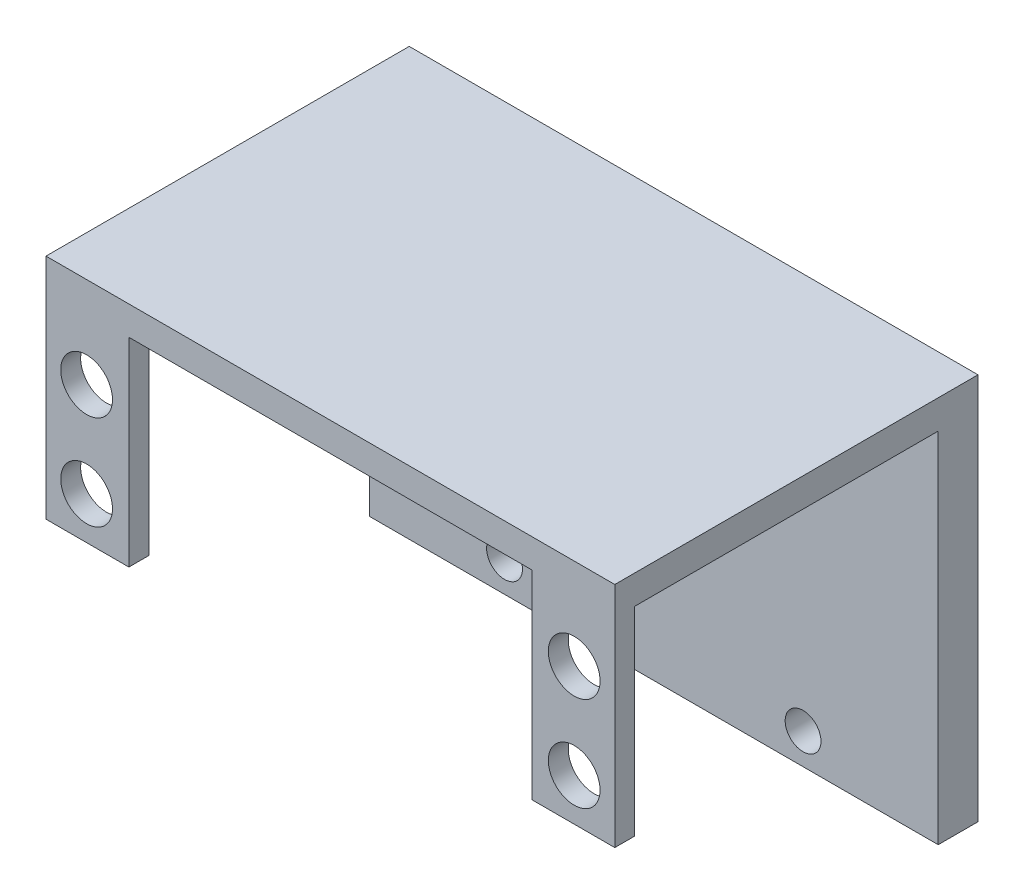
ISO-10303-21;
HEADER;
FILE_DESCRIPTION(('STEP AP214'),'2;1');
FILE_NAME('part.step','',(''),(''),'','','');
FILE_SCHEMA(('AUTOMOTIVE_DESIGN { 1 0 10303 214 1 1 1 1 }'));
ENDSEC;
DATA;
#1=APPLICATION_CONTEXT('core data for automotive mechanical design processes');
#2=APPLICATION_PROTOCOL_DEFINITION('international standard','automotive_design',2000,#1);
#3=PRODUCT_CONTEXT('',#1,'mechanical');
#4=PRODUCT('Part','Part','',(#3));
#5=PRODUCT_RELATED_PRODUCT_CATEGORY('part','',(#4));
#6=PRODUCT_DEFINITION_FORMATION('','',#4);
#7=PRODUCT_DEFINITION_CONTEXT('part definition',#1,'design');
#8=PRODUCT_DEFINITION('design','',#6,#7);
#9=PRODUCT_DEFINITION_SHAPE('','',#8);
#10=(LENGTH_UNIT() NAMED_UNIT(*) SI_UNIT(.MILLI.,.METRE.));
#11=(NAMED_UNIT(*) PLANE_ANGLE_UNIT() SI_UNIT($,.RADIAN.));
#12=(NAMED_UNIT(*) SI_UNIT($,.STERADIAN.) SOLID_ANGLE_UNIT());
#13=UNCERTAINTY_MEASURE_WITH_UNIT(LENGTH_MEASURE(1.E-05),#10,'distance_accuracy_value','');
#14=(GEOMETRIC_REPRESENTATION_CONTEXT(3) GLOBAL_UNCERTAINTY_ASSIGNED_CONTEXT((#13)) GLOBAL_UNIT_ASSIGNED_CONTEXT((#10,
#11,#12)) REPRESENTATION_CONTEXT('',''));
#15=CARTESIAN_POINT('',(0.,0.,0.));
#16=DIRECTION('',(0.,0.,1.));
#17=DIRECTION('',(1.,0.,0.));
#18=AXIS2_PLACEMENT_3D('',#15,#16,#17);
#19=CARTESIAN_POINT('',(28.5798247961856,0.,2.));
#20=DIRECTION('',(-1.,0.,0.));
#21=DIRECTION('',(0.,0.,1.));
#22=AXIS2_PLACEMENT_3D('',#19,#20,#21);
#23=PLANE('',#22);
#24=DIRECTION('',(0.,1.,0.));
#25=VECTOR('',#24,1.);
#26=CARTESIAN_POINT('',(28.5798247961856,0.,0.));
#27=LINE('',#26,#25);
#28=CARTESIAN_POINT('',(28.5798247961856,-8.99999999999997,0.));
#29=VERTEX_POINT('',#28);
#30=CARTESIAN_POINT('',(28.5798247961856,11.,0.));
#31=VERTEX_POINT('',#30);
#32=EDGE_CURVE('E257',#29,#31,#27,.T.);
#33=ORIENTED_EDGE('',*,*,#32,.T.);
#34=DIRECTION('',(0.,0.,1.));
#35=VECTOR('',#34,1.);
#36=CARTESIAN_POINT('',(28.5798247961856,11.,-30.5));
#37=LINE('',#36,#35);
#38=CARTESIAN_POINT('',(28.5798247961856,11.,-30.5));
#39=VERTEX_POINT('',#38);
#40=EDGE_CURVE('E160',#39,#31,#37,.T.);
#41=ORIENTED_EDGE('',*,*,#40,.F.);
#42=DIRECTION('',(0.,1.,0.));
#43=VECTOR('',#42,1.);
#44=CARTESIAN_POINT('',(28.5798247961856,-25.,-30.5));
#45=LINE('',#44,#43);
#46=CARTESIAN_POINT('',(28.5798247961856,-25.,-30.5));
#47=VERTEX_POINT('',#46);
#48=EDGE_CURVE('E150',#47,#39,#45,.T.);
#49=ORIENTED_EDGE('',*,*,#48,.F.);
#50=DIRECTION('',(0.,0.,1.));
#51=VECTOR('',#50,1.);
#52=CARTESIAN_POINT('',(28.5798247961856,-25.,-34.5));
#53=LINE('',#52,#51);
#54=CARTESIAN_POINT('',(28.5798247961856,-25.,-34.5));
#55=VERTEX_POINT('',#54);
#56=EDGE_CURVE('E207',#55,#47,#53,.T.);
#57=ORIENTED_EDGE('',*,*,#56,.F.);
#58=DIRECTION('',(0.,-1.,0.));
#59=VECTOR('',#58,1.);
#60=CARTESIAN_POINT('',(28.5798247961856,21.9,-34.5));
#61=LINE('',#60,#59);
#62=CARTESIAN_POINT('',(28.5798247961856,13.9,-34.5));
#63=VERTEX_POINT('',#62);
#64=EDGE_CURVE('E218',#63,#55,#61,.T.);
#65=ORIENTED_EDGE('',*,*,#64,.F.);
#66=DIRECTION('',(0.,0.,-1.));
#67=VECTOR('',#66,1.);
#68=CARTESIAN_POINT('',(28.5798247961856,13.9,2.));
#69=LINE('',#68,#67);
#70=CARTESIAN_POINT('',(28.5798247961856,13.9,2.));
#71=VERTEX_POINT('',#70);
#72=EDGE_CURVE('E182',#71,#63,#69,.T.);
#73=ORIENTED_EDGE('',*,*,#72,.F.);
#74=DIRECTION('',(0.,1.,0.));
#75=VECTOR('',#74,1.);
#76=CARTESIAN_POINT('',(28.5798247961856,0.,2.));
#77=LINE('',#76,#75);
#78=CARTESIAN_POINT('',(28.5798247961856,-8.99999999999997,2.));
#79=VERTEX_POINT('',#78);
#80=EDGE_CURVE('E92',#79,#71,#77,.T.);
#81=ORIENTED_EDGE('',*,*,#80,.F.);
#82=DIRECTION('',(0.,0.,-1.));
#83=VECTOR('',#82,1.);
#84=CARTESIAN_POINT('',(28.5798247961856,-8.99999999999997,2.));
#85=LINE('',#84,#83);
#86=EDGE_CURVE('E11',#79,#29,#85,.T.);
#87=ORIENTED_EDGE('',*,*,#86,.T.);
#88=EDGE_LOOP('',(#33,#41,#49,#57,#65,#73,#81,#87));
#89=FACE_BOUND('',#88,.T.);
#90=ADVANCED_FACE('F41',(#89),#23,.F.);
#91=CARTESIAN_POINT('',(-28.5798247961856,0.,2.));
#92=DIRECTION('',(-1.,0.,0.));
#93=DIRECTION('',(0.,0.,1.));
#94=AXIS2_PLACEMENT_3D('',#91,#92,#93);
#95=PLANE('',#94);
#96=DIRECTION('',(0.,0.,-1.));
#97=VECTOR('',#96,1.);
#98=CARTESIAN_POINT('',(-28.5798247961856,11.,0.));
#99=LINE('',#98,#97);
#100=CARTESIAN_POINT('',(-28.5798247961856,11.,0.));
#101=VERTEX_POINT('',#100);
#102=CARTESIAN_POINT('',(-28.5798247961856,11.,-30.5));
#103=VERTEX_POINT('',#102);
#104=EDGE_CURVE('E146',#101,#103,#99,.T.);
#105=ORIENTED_EDGE('',*,*,#104,.F.);
#106=DIRECTION('',(0.,1.,0.));
#107=VECTOR('',#106,1.);
#108=CARTESIAN_POINT('',(-28.5798247961856,0.,0.));
#109=LINE('',#108,#107);
#110=CARTESIAN_POINT('',(-28.5798247961856,-8.99999999999997,0.));
#111=VERTEX_POINT('',#110);
#112=EDGE_CURVE('E259',#111,#101,#109,.T.);
#113=ORIENTED_EDGE('',*,*,#112,.F.);
#114=DIRECTION('',(0.,0.,-1.));
#115=VECTOR('',#114,1.);
#116=CARTESIAN_POINT('',(-28.5798247961856,-8.99999999999997,2.));
#117=LINE('',#116,#115);
#118=CARTESIAN_POINT('',(-28.5798247961856,-8.99999999999997,2.));
#119=VERTEX_POINT('',#118);
#120=EDGE_CURVE('E51',#119,#111,#117,.T.);
#121=ORIENTED_EDGE('',*,*,#120,.F.);
#122=DIRECTION('',(0.,1.,0.));
#123=VECTOR('',#122,1.);
#124=CARTESIAN_POINT('',(-28.5798247961856,0.,2.));
#125=LINE('',#124,#123);
#126=CARTESIAN_POINT('',(-28.5798247961856,13.9,2.));
#127=VERTEX_POINT('',#126);
#128=EDGE_CURVE('E234',#119,#127,#125,.T.);
#129=ORIENTED_EDGE('',*,*,#128,.T.);
#130=DIRECTION('',(0.,0.,1.));
#131=VECTOR('',#130,1.);
#132=CARTESIAN_POINT('',(-28.5798247961856,13.9,-34.5));
#133=LINE('',#132,#131);
#134=CARTESIAN_POINT('',(-28.5798247961856,13.9,-34.5));
#135=VERTEX_POINT('',#134);
#136=EDGE_CURVE('E188',#135,#127,#133,.T.);
#137=ORIENTED_EDGE('',*,*,#136,.F.);
#138=DIRECTION('',(0.,1.,0.));
#139=VECTOR('',#138,1.);
#140=CARTESIAN_POINT('',(-28.5798247961856,10.,-34.5));
#141=LINE('',#140,#139);
#142=CARTESIAN_POINT('',(-28.5798247961856,-25.,-34.5));
#143=VERTEX_POINT('',#142);
#144=EDGE_CURVE('E216',#143,#135,#141,.T.);
#145=ORIENTED_EDGE('',*,*,#144,.F.);
#146=DIRECTION('',(0.,0.,-1.));
#147=VECTOR('',#146,1.);
#148=CARTESIAN_POINT('',(-28.5798247961856,-25.,-34.5));
#149=LINE('',#148,#147);
#150=CARTESIAN_POINT('',(-28.5798247961856,-25.,-30.5));
#151=VERTEX_POINT('',#150);
#152=EDGE_CURVE('E148',#151,#143,#149,.T.);
#153=ORIENTED_EDGE('',*,*,#152,.F.);
#154=DIRECTION('',(0.,1.,0.));
#155=VECTOR('',#154,1.);
#156=CARTESIAN_POINT('',(-28.5798247961856,-25.,-30.5));
#157=LINE('',#156,#155);
#158=EDGE_CURVE('E141',#151,#103,#157,.T.);
#159=ORIENTED_EDGE('',*,*,#158,.T.);
#160=EDGE_LOOP('',(#105,#113,#121,#129,#137,#145,#153,#159));
#161=FACE_BOUND('',#160,.T.);
#162=ADVANCED_FACE('F143',(#161),#95,.T.);
#163=CARTESIAN_POINT('',(0.,0.,2.));
#164=DIRECTION('',(0.,0.,1.));
#165=DIRECTION('',(1.,0.,0.));
#166=AXIS2_PLACEMENT_3D('',#163,#164,#165);
#167=PLANE('',#166);
#168=DIRECTION('',(0.,1.,0.));
#169=VECTOR('',#168,1.);
#170=CARTESIAN_POINT('',(-20.2500000000001,0.,2.));
#171=LINE('',#170,#169);
#172=CARTESIAN_POINT('',(-20.2500000000001,-8.99999999999997,2.));
#173=VERTEX_POINT('',#172);
#174=CARTESIAN_POINT('',(-20.2500000000001,11.,2.));
#175=VERTEX_POINT('',#174);
#176=EDGE_CURVE('E239',#173,#175,#171,.T.);
#177=ORIENTED_EDGE('',*,*,#176,.T.);
#178=DIRECTION('',(-1.,0.,0.));
#179=VECTOR('',#178,1.);
#180=CARTESIAN_POINT('',(20.2499999999999,11.,2.));
#181=LINE('',#180,#179);
#182=CARTESIAN_POINT('',(20.2499999999999,11.,2.));
#183=VERTEX_POINT('',#182);
#184=EDGE_CURVE('E176',#183,#175,#181,.T.);
#185=ORIENTED_EDGE('',*,*,#184,.F.);
#186=DIRECTION('',(2.25514051876985E-13,-1.,0.));
#187=VECTOR('',#186,1.);
#188=CARTESIAN_POINT('',(20.2500000000021,4.56665955050943E-12,2.));
#189=LINE('',#188,#187);
#190=CARTESIAN_POINT('',(20.2500000000001,-8.99999999999997,2.));
#191=VERTEX_POINT('',#190);
#192=EDGE_CURVE('E60',#183,#191,#189,.T.);
#193=ORIENTED_EDGE('',*,*,#192,.T.);
#194=DIRECTION('',(1.,0.,0.));
#195=VECTOR('',#194,1.);
#196=CARTESIAN_POINT('',(0.,-8.99999999999997,2.));
#197=LINE('',#196,#195);
#198=EDGE_CURVE('E231',#191,#79,#197,.T.);
#199=ORIENTED_EDGE('',*,*,#198,.T.);
#200=ORIENTED_EDGE('',*,*,#80,.T.);
#201=DIRECTION('',(1.,0.,0.));
#202=VECTOR('',#201,1.);
#203=CARTESIAN_POINT('',(-28.5798247961856,13.9,2.));
#204=LINE('',#203,#202);
#205=EDGE_CURVE('E191',#127,#71,#204,.T.);
#206=ORIENTED_EDGE('',*,*,#205,.F.);
#207=ORIENTED_EDGE('',*,*,#128,.F.);
#208=DIRECTION('',(-1.,0.,0.));
#209=VECTOR('',#208,1.);
#210=CARTESIAN_POINT('',(0.,-8.99999999999997,2.));
#211=LINE('',#210,#209);
#212=EDGE_CURVE('E236',#173,#119,#211,.T.);
#213=ORIENTED_EDGE('',*,*,#212,.F.);
#214=EDGE_LOOP('',(#177,#185,#193,#199,#200,#206,#207,#213));
#215=FACE_BOUND('',#214,.T.);
#216=CARTESIAN_POINT('',(24.5000000000001,4.75000000000002,2.));
#217=DIRECTION('',(0.,0.,1.));
#218=DIRECTION('',(1.,0.,0.));
#219=AXIS2_PLACEMENT_3D('',#216,#217,#218);
#220=CIRCLE('',#219,2.6);
#221=CARTESIAN_POINT('',(27.1000000000001,4.75000000000002,2.));
#222=VERTEX_POINT('',#221);
#223=EDGE_CURVE('E221',#222,#222,#220,.F.);
#224=ORIENTED_EDGE('',*,*,#223,.T.);
#225=EDGE_LOOP('',(#224));
#226=FACE_BOUND('',#225,.T.);
#227=CARTESIAN_POINT('',(24.5000000000001,-4.74999999999997,2.));
#228=DIRECTION('',(0.,0.,1.));
#229=DIRECTION('',(1.,0.,0.));
#230=AXIS2_PLACEMENT_3D('',#227,#228,#229);
#231=CIRCLE('',#230,2.6);
#232=CARTESIAN_POINT('',(27.1000000000001,-4.74999999999997,2.));
#233=VERTEX_POINT('',#232);
#234=EDGE_CURVE('E242',#233,#233,#231,.F.);
#235=ORIENTED_EDGE('',*,*,#234,.T.);
#236=EDGE_LOOP('',(#235));
#237=FACE_BOUND('',#236,.T.);
#238=CARTESIAN_POINT('',(-24.5000000000001,4.75000000000002,2.));
#239=DIRECTION('',(0.,0.,1.));
#240=DIRECTION('',(1.,0.,0.));
#241=AXIS2_PLACEMENT_3D('',#238,#239,#240);
#242=CIRCLE('',#241,2.6);
#243=CARTESIAN_POINT('',(-21.9000000000001,4.75000000000002,2.));
#244=VERTEX_POINT('',#243);
#245=EDGE_CURVE('E224',#244,#244,#242,.T.);
#246=ORIENTED_EDGE('',*,*,#245,.F.);
#247=EDGE_LOOP('',(#246));
#248=FACE_BOUND('',#247,.T.);
#249=CARTESIAN_POINT('',(-24.5000000000001,-4.74999999999997,2.));
#250=DIRECTION('',(0.,0.,1.));
#251=DIRECTION('',(1.,0.,0.));
#252=AXIS2_PLACEMENT_3D('',#249,#250,#251);
#253=CIRCLE('',#252,2.6);
#254=CARTESIAN_POINT('',(-21.9000000000001,-4.74999999999997,2.));
#255=VERTEX_POINT('',#254);
#256=EDGE_CURVE('E228',#255,#255,#253,.T.);
#257=ORIENTED_EDGE('',*,*,#256,.F.);
#258=EDGE_LOOP('',(#257));
#259=FACE_BOUND('',#258,.T.);
#260=ADVANCED_FACE('F305',(#215,#226,#237,#248,#259),#167,.T.);
#261=CARTESIAN_POINT('',(0.,0.,-34.5));
#262=DIRECTION('',(0.,0.,-1.));
#263=DIRECTION('',(-1.,0.,0.));
#264=AXIS2_PLACEMENT_3D('',#261,#262,#263);
#265=PLANE('',#264);
#266=CARTESIAN_POINT('',(-15.,8.10231343997278,-34.5));
#267=DIRECTION('',(0.,0.,-1.));
#268=DIRECTION('',(-1.,0.,0.));
#269=AXIS2_PLACEMENT_3D('',#266,#267,#268);
#270=CIRCLE('',#269,1.8);
#271=CARTESIAN_POINT('',(-16.8,8.10231343997278,-34.5));
#272=VERTEX_POINT('',#271);
#273=EDGE_CURVE('E194',#272,#272,#270,.T.);
#274=ORIENTED_EDGE('',*,*,#273,.F.);
#275=EDGE_LOOP('',(#274));
#276=FACE_BOUND('',#275,.T.);
#277=CARTESIAN_POINT('',(15.,-21.8976865600272,-34.5));
#278=DIRECTION('',(0.,0.,-1.));
#279=DIRECTION('',(-1.,0.,0.));
#280=AXIS2_PLACEMENT_3D('',#277,#278,#279);
#281=CIRCLE('',#280,1.8);
#282=CARTESIAN_POINT('',(13.2,-21.8976865600272,-34.5));
#283=VERTEX_POINT('',#282);
#284=EDGE_CURVE('E199',#283,#283,#281,.T.);
#285=ORIENTED_EDGE('',*,*,#284,.F.);
#286=EDGE_LOOP('',(#285));
#287=FACE_BOUND('',#286,.T.);
#288=CARTESIAN_POINT('',(-15.,-21.8976865600272,-34.5));
#289=DIRECTION('',(0.,0.,-1.));
#290=DIRECTION('',(-1.,0.,0.));
#291=AXIS2_PLACEMENT_3D('',#288,#289,#290);
#292=CIRCLE('',#291,1.80000000000001);
#293=CARTESIAN_POINT('',(-16.8,-21.8976865600272,-34.5));
#294=VERTEX_POINT('',#293);
#295=EDGE_CURVE('E195',#294,#294,#292,.T.);
#296=ORIENTED_EDGE('',*,*,#295,.F.);
#297=EDGE_LOOP('',(#296));
#298=FACE_BOUND('',#297,.T.);
#299=CARTESIAN_POINT('',(15.,8.10231343997279,-34.5));
#300=DIRECTION('',(0.,0.,-1.));
#301=DIRECTION('',(-1.,0.,0.));
#302=AXIS2_PLACEMENT_3D('',#299,#300,#301);
#303=CIRCLE('',#302,1.8);
#304=CARTESIAN_POINT('',(13.2,8.10231343997279,-34.5));
#305=VERTEX_POINT('',#304);
#306=EDGE_CURVE('E198',#305,#305,#303,.T.);
#307=ORIENTED_EDGE('',*,*,#306,.F.);
#308=EDGE_LOOP('',(#307));
#309=FACE_BOUND('',#308,.T.);
#310=ORIENTED_EDGE('',*,*,#144,.T.);
#311=DIRECTION('',(-1.,0.,0.));
#312=VECTOR('',#311,1.);
#313=CARTESIAN_POINT('',(28.5798247961856,13.9,-34.5));
#314=LINE('',#313,#312);
#315=EDGE_CURVE('E185',#63,#135,#314,.T.);
#316=ORIENTED_EDGE('',*,*,#315,.F.);
#317=ORIENTED_EDGE('',*,*,#64,.T.);
#318=DIRECTION('',(1.,0.,0.));
#319=VECTOR('',#318,1.);
#320=CARTESIAN_POINT('',(28.5798247961856,-25.,-34.5));
#321=LINE('',#320,#319);
#322=EDGE_CURVE('E151',#143,#55,#321,.T.);
#323=ORIENTED_EDGE('',*,*,#322,.F.);
#324=EDGE_LOOP('',(#310,#316,#317,#323));
#325=FACE_BOUND('',#324,.T.);
#326=ADVANCED_FACE('F333',(#276,#287,#298,#309,#325),#265,.T.);
#327=CARTESIAN_POINT('',(0.,0.,0.));
#328=DIRECTION('',(0.,0.,1.));
#329=DIRECTION('',(1.,0.,0.));
#330=AXIS2_PLACEMENT_3D('',#327,#328,#329);
#331=PLANE('',#330);
#332=CARTESIAN_POINT('',(-24.5000000000001,-4.74999999999997,0.));
#333=DIRECTION('',(0.,0.,1.));
#334=DIRECTION('',(1.,0.,0.));
#335=AXIS2_PLACEMENT_3D('',#332,#333,#334);
#336=CIRCLE('',#335,2.6);
#337=CARTESIAN_POINT('',(-21.9000000000001,-4.74999999999997,0.));
#338=VERTEX_POINT('',#337);
#339=EDGE_CURVE('E251',#338,#338,#336,.T.);
#340=ORIENTED_EDGE('',*,*,#339,.T.);
#341=EDGE_LOOP('',(#340));
#342=FACE_BOUND('',#341,.T.);
#343=CARTESIAN_POINT('',(-24.5000000000001,4.75000000000002,0.));
#344=DIRECTION('',(0.,0.,1.));
#345=DIRECTION('',(1.,0.,0.));
#346=AXIS2_PLACEMENT_3D('',#343,#344,#345);
#347=CIRCLE('',#346,2.6);
#348=CARTESIAN_POINT('',(-21.9000000000001,4.75000000000002,0.));
#349=VERTEX_POINT('',#348);
#350=EDGE_CURVE('E248',#349,#349,#347,.T.);
#351=ORIENTED_EDGE('',*,*,#350,.T.);
#352=EDGE_LOOP('',(#351));
#353=FACE_BOUND('',#352,.T.);
#354=ORIENTED_EDGE('',*,*,#112,.T.);
#355=DIRECTION('',(-1.,0.,0.));
#356=VECTOR('',#355,1.);
#357=CARTESIAN_POINT('',(-20.2500000000001,11.,0.));
#358=LINE('',#357,#356);
#359=CARTESIAN_POINT('',(-20.2500000000001,11.,0.));
#360=VERTEX_POINT('',#359);
#361=EDGE_CURVE('E166',#360,#101,#358,.T.);
#362=ORIENTED_EDGE('',*,*,#361,.F.);
#363=DIRECTION('',(0.,1.,0.));
#364=VECTOR('',#363,1.);
#365=CARTESIAN_POINT('',(-20.2500000000001,0.,0.));
#366=LINE('',#365,#364);
#367=CARTESIAN_POINT('',(-20.2500000000001,-8.99999999999997,0.));
#368=VERTEX_POINT('',#367);
#369=EDGE_CURVE('E264',#368,#360,#366,.T.);
#370=ORIENTED_EDGE('',*,*,#369,.F.);
#371=DIRECTION('',(-1.,0.,0.));
#372=VECTOR('',#371,1.);
#373=CARTESIAN_POINT('',(0.,-8.99999999999997,0.));
#374=LINE('',#373,#372);
#375=EDGE_CURVE('E261',#368,#111,#374,.T.);
#376=ORIENTED_EDGE('',*,*,#375,.T.);
#377=EDGE_LOOP('',(#354,#362,#370,#376));
#378=FACE_BOUND('',#377,.T.);
#379=ADVANCED_FACE('F313',(#342,#353,#378),#331,.F.);
#380=CARTESIAN_POINT('',(0.,-8.99999999999997,2.));
#381=DIRECTION('',(0.,1.,0.));
#382=DIRECTION('',(0.,0.,1.));
#383=AXIS2_PLACEMENT_3D('',#380,#381,#382);
#384=PLANE('',#383);
#385=DIRECTION('',(1.,0.,0.));
#386=VECTOR('',#385,1.);
#387=CARTESIAN_POINT('',(0.,-8.99999999999997,0.));
#388=LINE('',#387,#386);
#389=CARTESIAN_POINT('',(20.2500000000001,-8.99999999999997,0.));
#390=VERTEX_POINT('',#389);
#391=EDGE_CURVE('E254',#390,#29,#388,.T.);
#392=ORIENTED_EDGE('',*,*,#391,.T.);
#393=ORIENTED_EDGE('',*,*,#86,.F.);
#394=ORIENTED_EDGE('',*,*,#198,.F.);
#395=DIRECTION('',(0.,0.,-1.));
#396=VECTOR('',#395,1.);
#397=CARTESIAN_POINT('',(20.2500000000001,-8.99999999999997,2.));
#398=LINE('',#397,#396);
#399=EDGE_CURVE('E245',#191,#390,#398,.T.);
#400=ORIENTED_EDGE('',*,*,#399,.T.);
#401=EDGE_LOOP('',(#392,#393,#394,#400));
#402=FACE_BOUND('',#401,.T.);
#403=ADVANCED_FACE('F309',(#402),#384,.F.);
#404=CARTESIAN_POINT('',(0.,-8.99999999999997,2.));
#405=DIRECTION('',(0.,-1.,0.));
#406=DIRECTION('',(0.,0.,-1.));
#407=AXIS2_PLACEMENT_3D('',#404,#405,#406);
#408=PLANE('',#407);
#409=ORIENTED_EDGE('',*,*,#375,.F.);
#410=DIRECTION('',(0.,0.,-1.));
#411=VECTOR('',#410,1.);
#412=CARTESIAN_POINT('',(-20.2500000000001,-8.99999999999997,2.));
#413=LINE('',#412,#411);
#414=EDGE_CURVE('E78',#173,#368,#413,.T.);
#415=ORIENTED_EDGE('',*,*,#414,.F.);
#416=ORIENTED_EDGE('',*,*,#212,.T.);
#417=ORIENTED_EDGE('',*,*,#120,.T.);
#418=EDGE_LOOP('',(#409,#415,#416,#417));
#419=FACE_BOUND('',#418,.T.);
#420=ADVANCED_FACE('F312',(#419),#408,.T.);
#421=CARTESIAN_POINT('',(-20.2500000000001,0.,2.));
#422=DIRECTION('',(-1.,0.,0.));
#423=DIRECTION('',(0.,-1.,0.));
#424=AXIS2_PLACEMENT_3D('',#421,#422,#423);
#425=PLANE('',#424);
#426=ORIENTED_EDGE('',*,*,#369,.T.);
#427=DIRECTION('',(0.,0.,-1.));
#428=VECTOR('',#427,1.);
#429=CARTESIAN_POINT('',(-20.2500000000001,11.,2.));
#430=LINE('',#429,#428);
#431=EDGE_CURVE('E179',#175,#360,#430,.T.);
#432=ORIENTED_EDGE('',*,*,#431,.F.);
#433=ORIENTED_EDGE('',*,*,#176,.F.);
#434=ORIENTED_EDGE('',*,*,#414,.T.);
#435=EDGE_LOOP('',(#426,#432,#433,#434));
#436=FACE_BOUND('',#435,.T.);
#437=ADVANCED_FACE('F345',(#436),#425,.F.);
#438=CARTESIAN_POINT('',(20.2500000000021,4.56665955050943E-12,2.));
#439=DIRECTION('',(1.,2.25514051876985E-13,0.));
#440=DIRECTION('',(-2.25514051876985E-13,1.,0.));
#441=AXIS2_PLACEMENT_3D('',#438,#439,#440);
#442=PLANE('',#441);
#443=DIRECTION('',(2.25514051876985E-13,-1.,0.));
#444=VECTOR('',#443,1.);
#445=CARTESIAN_POINT('',(20.2500000000021,4.56665955050943E-12,0.));
#446=LINE('',#445,#444);
#447=CARTESIAN_POINT('',(20.2499999999999,11.,0.));
#448=VERTEX_POINT('',#447);
#449=EDGE_CURVE('E85',#448,#390,#446,.T.);
#450=ORIENTED_EDGE('',*,*,#449,.T.);
#451=ORIENTED_EDGE('',*,*,#399,.F.);
#452=ORIENTED_EDGE('',*,*,#192,.F.);
#453=DIRECTION('',(0.,0.,1.));
#454=VECTOR('',#453,1.);
#455=CARTESIAN_POINT('',(20.2499999999999,11.,0.));
#456=LINE('',#455,#454);
#457=EDGE_CURVE('E173',#448,#183,#456,.T.);
#458=ORIENTED_EDGE('',*,*,#457,.F.);
#459=EDGE_LOOP('',(#450,#451,#452,#458));
#460=FACE_BOUND('',#459,.T.);
#461=ADVANCED_FACE('F318',(#460),#442,.F.);
#462=CARTESIAN_POINT('',(-24.5000000000001,-4.74999999999997,2.));
#463=DIRECTION('',(0.,0.,-1.));
#464=DIRECTION('',(-1.,0.,0.));
#465=AXIS2_PLACEMENT_3D('',#462,#463,#464);
#466=CYLINDRICAL_SURFACE('',#465,2.6);
#467=ORIENTED_EDGE('',*,*,#256,.T.);
#468=EDGE_LOOP('',(#467));
#469=FACE_BOUND('',#468,.T.);
#470=ORIENTED_EDGE('',*,*,#339,.F.);
#471=EDGE_LOOP('',(#470));
#472=FACE_BOUND('',#471,.T.);
#473=ADVANCED_FACE('F315',(#469,#472),#466,.F.);
#474=CARTESIAN_POINT('',(-24.5000000000001,4.75000000000002,2.));
#475=DIRECTION('',(0.,0.,-1.));
#476=DIRECTION('',(-1.,0.,0.));
#477=AXIS2_PLACEMENT_3D('',#474,#475,#476);
#478=CYLINDRICAL_SURFACE('',#477,2.6);
#479=ORIENTED_EDGE('',*,*,#245,.T.);
#480=EDGE_LOOP('',(#479));
#481=FACE_BOUND('',#480,.T.);
#482=ORIENTED_EDGE('',*,*,#350,.F.);
#483=EDGE_LOOP('',(#482));
#484=FACE_BOUND('',#483,.T.);
#485=ADVANCED_FACE('F317',(#481,#484),#478,.F.);
#486=CARTESIAN_POINT('',(24.5000000000001,4.75000000000002,2.));
#487=DIRECTION('',(0.,0.,-1.));
#488=DIRECTION('',(-1.,0.,0.));
#489=AXIS2_PLACEMENT_3D('',#486,#487,#488);
#490=CYLINDRICAL_SURFACE('',#489,2.6);
#491=ORIENTED_EDGE('',*,*,#223,.F.);
#492=EDGE_LOOP('',(#491));
#493=FACE_BOUND('',#492,.T.);
#494=CARTESIAN_POINT('',(24.5000000000001,4.75000000000002,0.));
#495=DIRECTION('',(0.,0.,1.));
#496=DIRECTION('',(1.,0.,0.));
#497=AXIS2_PLACEMENT_3D('',#494,#495,#496);
#498=CIRCLE('',#497,2.6);
#499=CARTESIAN_POINT('',(27.1000000000001,4.75000000000002,0.));
#500=VERTEX_POINT('',#499);
#501=EDGE_CURVE('E220',#500,#500,#498,.F.);
#502=ORIENTED_EDGE('',*,*,#501,.T.);
#503=EDGE_LOOP('',(#502));
#504=FACE_BOUND('',#503,.T.);
#505=ADVANCED_FACE('F43',(#493,#504),#490,.F.);
#506=CARTESIAN_POINT('',(24.5000000000001,-4.74999999999997,2.));
#507=DIRECTION('',(0.,0.,-1.));
#508=DIRECTION('',(-1.,0.,0.));
#509=AXIS2_PLACEMENT_3D('',#506,#507,#508);
#510=CYLINDRICAL_SURFACE('',#509,2.6);
#511=ORIENTED_EDGE('',*,*,#234,.F.);
#512=EDGE_LOOP('',(#511));
#513=FACE_BOUND('',#512,.T.);
#514=CARTESIAN_POINT('',(24.5000000000001,-4.74999999999997,0.));
#515=DIRECTION('',(0.,0.,1.));
#516=DIRECTION('',(1.,0.,0.));
#517=AXIS2_PLACEMENT_3D('',#514,#515,#516);
#518=CIRCLE('',#517,2.6);
#519=CARTESIAN_POINT('',(27.1000000000001,-4.74999999999997,0.));
#520=VERTEX_POINT('',#519);
#521=EDGE_CURVE('E225',#520,#520,#518,.F.);
#522=ORIENTED_EDGE('',*,*,#521,.T.);
#523=EDGE_LOOP('',(#522));
#524=FACE_BOUND('',#523,.T.);
#525=ADVANCED_FACE('F325',(#513,#524),#510,.F.);
#526=ORIENTED_EDGE('',*,*,#501,.F.);
#527=EDGE_LOOP('',(#526));
#528=FACE_BOUND('',#527,.T.);
#529=ORIENTED_EDGE('',*,*,#449,.F.);
#530=DIRECTION('',(-1.,0.,0.));
#531=VECTOR('',#530,1.);
#532=CARTESIAN_POINT('',(28.5798247961856,11.,0.));
#533=LINE('',#532,#531);
#534=EDGE_CURVE('E170',#31,#448,#533,.T.);
#535=ORIENTED_EDGE('',*,*,#534,.F.);
#536=ORIENTED_EDGE('',*,*,#32,.F.);
#537=ORIENTED_EDGE('',*,*,#391,.F.);
#538=EDGE_LOOP('',(#529,#535,#536,#537));
#539=FACE_BOUND('',#538,.T.);
#540=ORIENTED_EDGE('',*,*,#521,.F.);
#541=EDGE_LOOP('',(#540));
#542=FACE_BOUND('',#541,.T.);
#543=ADVANCED_FACE('F336',(#528,#539,#542),#331,.F.);
#544=CARTESIAN_POINT('',(28.5798247961856,-25.,-30.5));
#545=DIRECTION('',(0.,0.,-1.));
#546=DIRECTION('',(-1.,0.,0.));
#547=AXIS2_PLACEMENT_3D('',#544,#545,#546);
#548=PLANE('',#547);
#549=CARTESIAN_POINT('',(-15.,8.10231343997278,-30.5));
#550=DIRECTION('',(0.,0.,-1.));
#551=DIRECTION('',(-1.,0.,0.));
#552=AXIS2_PLACEMENT_3D('',#549,#550,#551);
#553=CIRCLE('',#552,1.8);
#554=CARTESIAN_POINT('',(-16.8,8.10231343997278,-30.5));
#555=VERTEX_POINT('',#554);
#556=EDGE_CURVE('E45',#555,#555,#553,.T.);
#557=ORIENTED_EDGE('',*,*,#556,.T.);
#558=EDGE_LOOP('',(#557));
#559=FACE_BOUND('',#558,.T.);
#560=CARTESIAN_POINT('',(15.,-21.8976865600272,-30.5));
#561=DIRECTION('',(0.,0.,-1.));
#562=DIRECTION('',(-1.,0.,0.));
#563=AXIS2_PLACEMENT_3D('',#560,#561,#562);
#564=CIRCLE('',#563,1.8);
#565=CARTESIAN_POINT('',(13.2,-21.8976865600272,-30.5));
#566=VERTEX_POINT('',#565);
#567=EDGE_CURVE('E276',#566,#566,#564,.T.);
#568=ORIENTED_EDGE('',*,*,#567,.T.);
#569=EDGE_LOOP('',(#568));
#570=FACE_BOUND('',#569,.T.);
#571=CARTESIAN_POINT('',(-15.,-21.8976865600272,-30.5));
#572=DIRECTION('',(0.,0.,-1.));
#573=DIRECTION('',(-1.,0.,0.));
#574=AXIS2_PLACEMENT_3D('',#571,#572,#573);
#575=CIRCLE('',#574,1.80000000000001);
#576=CARTESIAN_POINT('',(-16.8,-21.8976865600272,-30.5));
#577=VERTEX_POINT('',#576);
#578=EDGE_CURVE('E274',#577,#577,#575,.T.);
#579=ORIENTED_EDGE('',*,*,#578,.T.);
#580=EDGE_LOOP('',(#579));
#581=FACE_BOUND('',#580,.T.);
#582=CARTESIAN_POINT('',(15.,8.10231343997279,-30.5));
#583=DIRECTION('',(0.,0.,-1.));
#584=DIRECTION('',(-1.,0.,0.));
#585=AXIS2_PLACEMENT_3D('',#582,#583,#584);
#586=CIRCLE('',#585,1.8);
#587=CARTESIAN_POINT('',(13.2,8.10231343997279,-30.5));
#588=VERTEX_POINT('',#587);
#589=EDGE_CURVE('E206',#588,#588,#586,.T.);
#590=ORIENTED_EDGE('',*,*,#589,.T.);
#591=EDGE_LOOP('',(#590));
#592=FACE_BOUND('',#591,.T.);
#593=ORIENTED_EDGE('',*,*,#48,.T.);
#594=DIRECTION('',(1.,0.,0.));
#595=VECTOR('',#594,1.);
#596=CARTESIAN_POINT('',(-28.5798247961856,11.,-30.5));
#597=LINE('',#596,#595);
#598=EDGE_CURVE('E154',#103,#39,#597,.T.);
#599=ORIENTED_EDGE('',*,*,#598,.F.);
#600=ORIENTED_EDGE('',*,*,#158,.F.);
#601=DIRECTION('',(-1.,0.,0.));
#602=VECTOR('',#601,1.);
#603=CARTESIAN_POINT('',(28.5798247961856,-25.,-30.5));
#604=LINE('',#603,#602);
#605=EDGE_CURVE('E210',#47,#151,#604,.T.);
#606=ORIENTED_EDGE('',*,*,#605,.F.);
#607=EDGE_LOOP('',(#593,#599,#600,#606));
#608=FACE_BOUND('',#607,.T.);
#609=ADVANCED_FACE('F155',(#559,#570,#581,#592,#608),#548,.F.);
#610=CARTESIAN_POINT('',(0.,-25.,0.));
#611=DIRECTION('',(0.,-1.,0.));
#612=DIRECTION('',(1.,0.,0.));
#613=AXIS2_PLACEMENT_3D('',#610,#611,#612);
#614=PLANE('',#613);
#615=ORIENTED_EDGE('',*,*,#56,.T.);
#616=ORIENTED_EDGE('',*,*,#605,.T.);
#617=ORIENTED_EDGE('',*,*,#152,.T.);
#618=ORIENTED_EDGE('',*,*,#322,.T.);
#619=EDGE_LOOP('',(#615,#616,#617,#618));
#620=FACE_BOUND('',#619,.T.);
#621=ADVANCED_FACE('F355',(#620),#614,.T.);
#622=CARTESIAN_POINT('',(15.,8.10231343997279,-24.5));
#623=DIRECTION('',(0.,0.,-1.));
#624=DIRECTION('',(-1.,0.,0.));
#625=AXIS2_PLACEMENT_3D('',#622,#623,#624);
#626=CYLINDRICAL_SURFACE('',#625,1.8);
#627=ORIENTED_EDGE('',*,*,#306,.T.);
#628=EDGE_LOOP('',(#627));
#629=FACE_BOUND('',#628,.T.);
#630=ORIENTED_EDGE('',*,*,#589,.F.);
#631=EDGE_LOOP('',(#630));
#632=FACE_BOUND('',#631,.T.);
#633=ADVANCED_FACE('F421',(#629,#632),#626,.F.);
#634=CARTESIAN_POINT('',(-15.,-21.8976865600272,-24.5));
#635=DIRECTION('',(0.,0.,-1.));
#636=DIRECTION('',(-1.,0.,0.));
#637=AXIS2_PLACEMENT_3D('',#634,#635,#636);
#638=CYLINDRICAL_SURFACE('',#637,1.80000000000001);
#639=ORIENTED_EDGE('',*,*,#295,.T.);
#640=EDGE_LOOP('',(#639));
#641=FACE_BOUND('',#640,.T.);
#642=ORIENTED_EDGE('',*,*,#578,.F.);
#643=EDGE_LOOP('',(#642));
#644=FACE_BOUND('',#643,.T.);
#645=ADVANCED_FACE('F296',(#641,#644),#638,.F.);
#646=CARTESIAN_POINT('',(15.,-21.8976865600272,-24.5));
#647=DIRECTION('',(0.,0.,-1.));
#648=DIRECTION('',(-1.,0.,0.));
#649=AXIS2_PLACEMENT_3D('',#646,#647,#648);
#650=CYLINDRICAL_SURFACE('',#649,1.8);
#651=ORIENTED_EDGE('',*,*,#284,.T.);
#652=EDGE_LOOP('',(#651));
#653=FACE_BOUND('',#652,.T.);
#654=ORIENTED_EDGE('',*,*,#567,.F.);
#655=EDGE_LOOP('',(#654));
#656=FACE_BOUND('',#655,.T.);
#657=ADVANCED_FACE('F287',(#653,#656),#650,.F.);
#658=CARTESIAN_POINT('',(-15.,8.10231343997278,-24.5));
#659=DIRECTION('',(0.,0.,-1.));
#660=DIRECTION('',(-1.,0.,0.));
#661=AXIS2_PLACEMENT_3D('',#658,#659,#660);
#662=CYLINDRICAL_SURFACE('',#661,1.8);
#663=ORIENTED_EDGE('',*,*,#273,.T.);
#664=EDGE_LOOP('',(#663));
#665=FACE_BOUND('',#664,.T.);
#666=ORIENTED_EDGE('',*,*,#556,.F.);
#667=EDGE_LOOP('',(#666));
#668=FACE_BOUND('',#667,.T.);
#669=ADVANCED_FACE('F284',(#665,#668),#662,.F.);
#670=CARTESIAN_POINT('',(0.,13.9,0.));
#671=DIRECTION('',(0.,1.,0.));
#672=DIRECTION('',(-1.,0.,0.));
#673=AXIS2_PLACEMENT_3D('',#670,#671,#672);
#674=PLANE('',#673);
#675=ORIENTED_EDGE('',*,*,#72,.T.);
#676=ORIENTED_EDGE('',*,*,#315,.T.);
#677=ORIENTED_EDGE('',*,*,#136,.T.);
#678=ORIENTED_EDGE('',*,*,#205,.T.);
#679=EDGE_LOOP('',(#675,#676,#677,#678));
#680=FACE_BOUND('',#679,.T.);
#681=ADVANCED_FACE('F286',(#680),#674,.T.);
#682=CARTESIAN_POINT('',(0.,11.,0.));
#683=DIRECTION('',(0.,-1.,0.));
#684=DIRECTION('',(1.,0.,0.));
#685=AXIS2_PLACEMENT_3D('',#682,#683,#684);
#686=PLANE('',#685);
#687=ORIENTED_EDGE('',*,*,#104,.T.);
#688=ORIENTED_EDGE('',*,*,#598,.T.);
#689=ORIENTED_EDGE('',*,*,#40,.T.);
#690=ORIENTED_EDGE('',*,*,#534,.T.);
#691=ORIENTED_EDGE('',*,*,#457,.T.);
#692=ORIENTED_EDGE('',*,*,#184,.T.);
#693=ORIENTED_EDGE('',*,*,#431,.T.);
#694=ORIENTED_EDGE('',*,*,#361,.T.);
#695=EDGE_LOOP('',(#687,#688,#689,#690,#691,#692,#693,#694));
#696=FACE_BOUND('',#695,.T.);
#697=ADVANCED_FACE('F163',(#696),#686,.T.);
#698=CLOSED_SHELL('',(#90,#162,#260,#326,#379,#403,#420,#437,#461,#473,#485,#505,#525,#543,#609,
#621,#633,#645,#657,#669,#681,#697));
#699=MANIFOLD_SOLID_BREP('B2',#698);
#700=ADVANCED_BREP_SHAPE_REPRESENTATION('',(#18,#699),#14);
#701=SHAPE_DEFINITION_REPRESENTATION(#9,#700);
ENDSEC;
END-ISO-10303-21;
